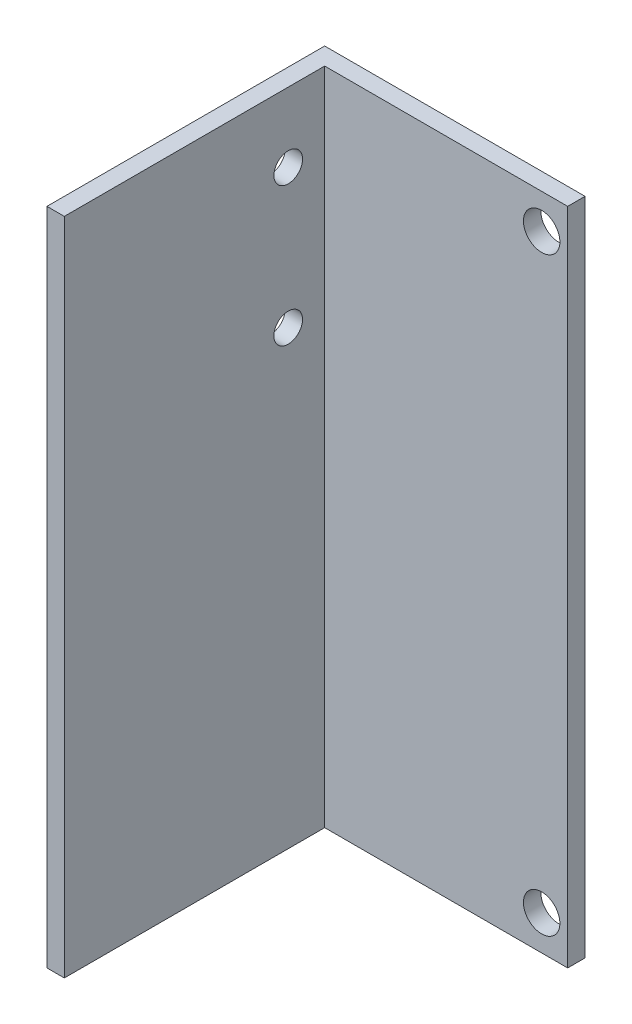
ISO-10303-21;
HEADER;
FILE_DESCRIPTION(('STEP AP214'),'2;1');
FILE_NAME('part.step','',(''),(''),'','','');
FILE_SCHEMA(('AUTOMOTIVE_DESIGN { 1 0 10303 214 1 1 1 1 }'));
ENDSEC;
DATA;
#1=APPLICATION_CONTEXT('core data for automotive mechanical design processes');
#2=APPLICATION_PROTOCOL_DEFINITION('international standard','automotive_design',2000,#1);
#3=PRODUCT_CONTEXT('',#1,'mechanical');
#4=PRODUCT('Part','Part','',(#3));
#5=PRODUCT_RELATED_PRODUCT_CATEGORY('part','',(#4));
#6=PRODUCT_DEFINITION_FORMATION('','',#4);
#7=PRODUCT_DEFINITION_CONTEXT('part definition',#1,'design');
#8=PRODUCT_DEFINITION('design','',#6,#7);
#9=PRODUCT_DEFINITION_SHAPE('','',#8);
#10=(LENGTH_UNIT() NAMED_UNIT(*) SI_UNIT(.MILLI.,.METRE.));
#11=(NAMED_UNIT(*) PLANE_ANGLE_UNIT() SI_UNIT($,.RADIAN.));
#12=(NAMED_UNIT(*) SI_UNIT($,.STERADIAN.) SOLID_ANGLE_UNIT());
#13=UNCERTAINTY_MEASURE_WITH_UNIT(LENGTH_MEASURE(1.E-05),#10,'distance_accuracy_value','');
#14=(GEOMETRIC_REPRESENTATION_CONTEXT(3) GLOBAL_UNCERTAINTY_ASSIGNED_CONTEXT((#13)) GLOBAL_UNIT_ASSIGNED_CONTEXT((#10,
#11,#12)) REPRESENTATION_CONTEXT('',''));
#15=CARTESIAN_POINT('',(0.,0.,0.));
#16=DIRECTION('',(0.,0.,1.));
#17=DIRECTION('',(1.,0.,0.));
#18=AXIS2_PLACEMENT_3D('',#15,#16,#17);
#19=CARTESIAN_POINT('',(0.,0.,2.));
#20=DIRECTION('',(1.,0.,0.));
#21=DIRECTION('',(0.,1.,0.));
#22=AXIS2_PLACEMENT_3D('',#19,#20,#21);
#23=PLANE('',#22);
#24=CARTESIAN_POINT('',(0.,-24.,6.2));
#25=DIRECTION('',(-1.,0.,0.));
#26=DIRECTION('',(0.,-1.,0.));
#27=AXIS2_PLACEMENT_3D('',#24,#25,#26);
#28=CIRCLE('',#27,1.65);
#29=CARTESIAN_POINT('',(0.,-25.65,6.2));
#30=VERTEX_POINT('',#29);
#31=EDGE_CURVE('E151',#30,#30,#28,.T.);
#32=ORIENTED_EDGE('',*,*,#31,.F.);
#33=EDGE_LOOP('',(#32));
#34=FACE_BOUND('',#33,.T.);
#35=CARTESIAN_POINT('',(0.,-8.,6.2));
#36=DIRECTION('',(-1.,0.,0.));
#37=DIRECTION('',(0.,-1.,0.));
#38=AXIS2_PLACEMENT_3D('',#35,#36,#37);
#39=CIRCLE('',#38,1.65);
#40=CARTESIAN_POINT('',(0.,-9.65,6.2));
#41=VERTEX_POINT('',#40);
#42=EDGE_CURVE('E140',#41,#41,#39,.T.);
#43=ORIENTED_EDGE('',*,*,#42,.F.);
#44=EDGE_LOOP('',(#43));
#45=FACE_BOUND('',#44,.T.);
#46=DIRECTION('',(0.,-1.,0.));
#47=VECTOR('',#46,1.);
#48=CARTESIAN_POINT('',(0.,0.,0.));
#49=LINE('',#48,#47);
#50=CARTESIAN_POINT('',(0.,0.,0.));
#51=VERTEX_POINT('',#50);
#52=CARTESIAN_POINT('',(0.,-76.,0.));
#53=VERTEX_POINT('',#52);
#54=EDGE_CURVE('E91',#51,#53,#49,.T.);
#55=ORIENTED_EDGE('',*,*,#54,.T.);
#56=DIRECTION('',(0.,0.,-1.));
#57=VECTOR('',#56,1.);
#58=CARTESIAN_POINT('',(0.,-76.,2.));
#59=LINE('',#58,#57);
#60=CARTESIAN_POINT('',(0.,-76.,32.));
#61=VERTEX_POINT('',#60);
#62=EDGE_CURVE('E11',#61,#53,#59,.T.);
#63=ORIENTED_EDGE('',*,*,#62,.F.);
#64=DIRECTION('',(0.,-1.,0.));
#65=VECTOR('',#64,1.);
#66=CARTESIAN_POINT('',(0.,0.,32.));
#67=LINE('',#66,#65);
#68=CARTESIAN_POINT('',(0.,0.,32.));
#69=VERTEX_POINT('',#68);
#70=EDGE_CURVE('E93',#69,#61,#67,.T.);
#71=ORIENTED_EDGE('',*,*,#70,.F.);
#72=DIRECTION('',(0.,0.,-1.));
#73=VECTOR('',#72,1.);
#74=CARTESIAN_POINT('',(0.,0.,2.));
#75=LINE('',#74,#73);
#76=EDGE_CURVE('E77',#69,#51,#75,.T.);
#77=ORIENTED_EDGE('',*,*,#76,.T.);
#78=EDGE_LOOP('',(#55,#63,#71,#77));
#79=FACE_BOUND('',#78,.T.);
#80=ADVANCED_FACE('F31',(#34,#45,#79),#23,.F.);
#81=CARTESIAN_POINT('',(0.,-76.,2.));
#82=DIRECTION('',(0.,1.,0.));
#83=DIRECTION('',(0.,0.,1.));
#84=AXIS2_PLACEMENT_3D('',#81,#82,#83);
#85=PLANE('',#84);
#86=DIRECTION('',(1.,0.,0.));
#87=VECTOR('',#86,1.);
#88=CARTESIAN_POINT('',(0.,-76.,0.));
#89=LINE('',#88,#87);
#90=CARTESIAN_POINT('',(30.,-76.,0.));
#91=VERTEX_POINT('',#90);
#92=EDGE_CURVE('E97',#53,#91,#89,.T.);
#93=ORIENTED_EDGE('',*,*,#92,.T.);
#94=DIRECTION('',(0.,0.,-1.));
#95=VECTOR('',#94,1.);
#96=CARTESIAN_POINT('',(30.,-76.,2.));
#97=LINE('',#96,#95);
#98=CARTESIAN_POINT('',(30.,-76.,2.));
#99=VERTEX_POINT('',#98);
#100=EDGE_CURVE('E39',#99,#91,#97,.T.);
#101=ORIENTED_EDGE('',*,*,#100,.F.);
#102=DIRECTION('',(1.,0.,0.));
#103=VECTOR('',#102,1.);
#104=CARTESIAN_POINT('',(0.,-76.,2.));
#105=LINE('',#104,#103);
#106=CARTESIAN_POINT('',(2.,-76.,2.));
#107=VERTEX_POINT('',#106);
#108=EDGE_CURVE('E84',#107,#99,#105,.T.);
#109=ORIENTED_EDGE('',*,*,#108,.F.);
#110=DIRECTION('',(0.,0.,-1.));
#111=VECTOR('',#110,1.);
#112=CARTESIAN_POINT('',(2.00000000000001,-76.,32.));
#113=LINE('',#112,#111);
#114=CARTESIAN_POINT('',(2.00000000000001,-76.,32.));
#115=VERTEX_POINT('',#114);
#116=EDGE_CURVE('E98',#115,#107,#113,.T.);
#117=ORIENTED_EDGE('',*,*,#116,.F.);
#118=DIRECTION('',(1.,0.,0.));
#119=VECTOR('',#118,1.);
#120=CARTESIAN_POINT('',(0.,-76.,32.));
#121=LINE('',#120,#119);
#122=EDGE_CURVE('E162',#61,#115,#121,.T.);
#123=ORIENTED_EDGE('',*,*,#122,.F.);
#124=ORIENTED_EDGE('',*,*,#62,.T.);
#125=EDGE_LOOP('',(#93,#101,#109,#117,#123,#124));
#126=FACE_BOUND('',#125,.T.);
#127=ADVANCED_FACE('F175',(#126),#85,.F.);
#128=CARTESIAN_POINT('',(30.,0.,2.));
#129=DIRECTION('',(-1.,0.,0.));
#130=DIRECTION('',(0.,-1.,0.));
#131=AXIS2_PLACEMENT_3D('',#128,#129,#130);
#132=PLANE('',#131);
#133=DIRECTION('',(0.,1.,0.));
#134=VECTOR('',#133,1.);
#135=CARTESIAN_POINT('',(30.,0.,0.));
#136=LINE('',#135,#134);
#137=CARTESIAN_POINT('',(30.,0.,0.));
#138=VERTEX_POINT('',#137);
#139=EDGE_CURVE('E85',#91,#138,#136,.T.);
#140=ORIENTED_EDGE('',*,*,#139,.T.);
#141=DIRECTION('',(0.,0.,-1.));
#142=VECTOR('',#141,1.);
#143=CARTESIAN_POINT('',(30.,0.,2.));
#144=LINE('',#143,#142);
#145=CARTESIAN_POINT('',(30.,0.,2.));
#146=VERTEX_POINT('',#145);
#147=EDGE_CURVE('E80',#146,#138,#144,.T.);
#148=ORIENTED_EDGE('',*,*,#147,.F.);
#149=DIRECTION('',(0.,1.,0.));
#150=VECTOR('',#149,1.);
#151=CARTESIAN_POINT('',(30.,0.,2.));
#152=LINE('',#151,#150);
#153=EDGE_CURVE('E53',#99,#146,#152,.T.);
#154=ORIENTED_EDGE('',*,*,#153,.F.);
#155=ORIENTED_EDGE('',*,*,#100,.T.);
#156=EDGE_LOOP('',(#140,#148,#154,#155));
#157=FACE_BOUND('',#156,.T.);
#158=ADVANCED_FACE('F178',(#157),#132,.F.);
#159=CARTESIAN_POINT('',(0.,0.,2.));
#160=DIRECTION('',(0.,-1.,0.));
#161=DIRECTION('',(0.,0.,-1.));
#162=AXIS2_PLACEMENT_3D('',#159,#160,#161);
#163=PLANE('',#162);
#164=DIRECTION('',(-1.,0.,0.));
#165=VECTOR('',#164,1.);
#166=CARTESIAN_POINT('',(0.,0.,0.));
#167=LINE('',#166,#165);
#168=EDGE_CURVE('E73',#138,#51,#167,.T.);
#169=ORIENTED_EDGE('',*,*,#168,.T.);
#170=ORIENTED_EDGE('',*,*,#76,.F.);
#171=DIRECTION('',(-1.,0.,0.));
#172=VECTOR('',#171,1.);
#173=CARTESIAN_POINT('',(0.,0.,32.));
#174=LINE('',#173,#172);
#175=CARTESIAN_POINT('',(2.,0.,32.));
#176=VERTEX_POINT('',#175);
#177=EDGE_CURVE('E130',#176,#69,#174,.T.);
#178=ORIENTED_EDGE('',*,*,#177,.F.);
#179=DIRECTION('',(0.,0.,-1.));
#180=VECTOR('',#179,1.);
#181=CARTESIAN_POINT('',(2.,0.,32.));
#182=LINE('',#181,#180);
#183=CARTESIAN_POINT('',(2.,0.,2.));
#184=VERTEX_POINT('',#183);
#185=EDGE_CURVE('E102',#176,#184,#182,.T.);
#186=ORIENTED_EDGE('',*,*,#185,.T.);
#187=DIRECTION('',(-1.,0.,0.));
#188=VECTOR('',#187,1.);
#189=CARTESIAN_POINT('',(0.,0.,2.));
#190=LINE('',#189,#188);
#191=EDGE_CURVE('E94',#146,#184,#190,.T.);
#192=ORIENTED_EDGE('',*,*,#191,.F.);
#193=ORIENTED_EDGE('',*,*,#147,.T.);
#194=EDGE_LOOP('',(#169,#170,#178,#186,#192,#193));
#195=FACE_BOUND('',#194,.T.);
#196=ADVANCED_FACE('F75',(#195),#163,.F.);
#197=CARTESIAN_POINT('',(0.,-76.,2.));
#198=DIRECTION('',(0.,0.,1.));
#199=DIRECTION('',(1.,0.,0.));
#200=AXIS2_PLACEMENT_3D('',#197,#198,#199);
#201=PLANE('',#200);
#202=CARTESIAN_POINT('',(27.,-72.,2.));
#203=DIRECTION('',(0.,0.,1.));
#204=DIRECTION('',(1.,0.,0.));
#205=AXIS2_PLACEMENT_3D('',#202,#203,#204);
#206=CIRCLE('',#205,2.1);
#207=CARTESIAN_POINT('',(29.1,-72.,2.));
#208=VERTEX_POINT('',#207);
#209=EDGE_CURVE('E144',#208,#208,#206,.T.);
#210=ORIENTED_EDGE('',*,*,#209,.F.);
#211=EDGE_LOOP('',(#210));
#212=FACE_BOUND('',#211,.T.);
#213=CARTESIAN_POINT('',(27.,-3.99999999999999,2.));
#214=DIRECTION('',(0.,0.,1.));
#215=DIRECTION('',(1.,0.,0.));
#216=AXIS2_PLACEMENT_3D('',#213,#214,#215);
#217=CIRCLE('',#216,2.1);
#218=CARTESIAN_POINT('',(29.1,-3.99999999999999,2.));
#219=VERTEX_POINT('',#218);
#220=EDGE_CURVE('E129',#219,#219,#217,.T.);
#221=ORIENTED_EDGE('',*,*,#220,.F.);
#222=EDGE_LOOP('',(#221));
#223=FACE_BOUND('',#222,.T.);
#224=DIRECTION('',(0.,1.,0.));
#225=VECTOR('',#224,1.);
#226=CARTESIAN_POINT('',(2.,0.,2.));
#227=LINE('',#226,#225);
#228=EDGE_CURVE('E47',#107,#184,#227,.T.);
#229=ORIENTED_EDGE('',*,*,#228,.F.);
#230=ORIENTED_EDGE('',*,*,#108,.T.);
#231=ORIENTED_EDGE('',*,*,#153,.T.);
#232=ORIENTED_EDGE('',*,*,#191,.T.);
#233=EDGE_LOOP('',(#229,#230,#231,#232));
#234=FACE_BOUND('',#233,.T.);
#235=ADVANCED_FACE('F120',(#212,#223,#234),#201,.T.);
#236=CARTESIAN_POINT('',(0.,-76.,0.));
#237=DIRECTION('',(0.,0.,1.));
#238=DIRECTION('',(1.,0.,0.));
#239=AXIS2_PLACEMENT_3D('',#236,#237,#238);
#240=PLANE('',#239);
#241=CARTESIAN_POINT('',(27.,-72.,0.));
#242=DIRECTION('',(0.,0.,-1.));
#243=DIRECTION('',(-1.,0.,0.));
#244=AXIS2_PLACEMENT_3D('',#241,#242,#243);
#245=CIRCLE('',#244,2.1);
#246=CARTESIAN_POINT('',(24.9,-72.,0.));
#247=VERTEX_POINT('',#246);
#248=EDGE_CURVE('E139',#247,#247,#245,.T.);
#249=ORIENTED_EDGE('',*,*,#248,.F.);
#250=EDGE_LOOP('',(#249));
#251=FACE_BOUND('',#250,.T.);
#252=CARTESIAN_POINT('',(27.,-3.99999999999999,0.));
#253=DIRECTION('',(0.,0.,-1.));
#254=DIRECTION('',(-1.,0.,0.));
#255=AXIS2_PLACEMENT_3D('',#252,#253,#254);
#256=CIRCLE('',#255,2.1);
#257=CARTESIAN_POINT('',(24.9,-3.99999999999999,0.));
#258=VERTEX_POINT('',#257);
#259=EDGE_CURVE('E156',#258,#258,#256,.T.);
#260=ORIENTED_EDGE('',*,*,#259,.F.);
#261=EDGE_LOOP('',(#260));
#262=FACE_BOUND('',#261,.T.);
#263=ORIENTED_EDGE('',*,*,#54,.F.);
#264=ORIENTED_EDGE('',*,*,#168,.F.);
#265=ORIENTED_EDGE('',*,*,#139,.F.);
#266=ORIENTED_EDGE('',*,*,#92,.F.);
#267=EDGE_LOOP('',(#263,#264,#265,#266));
#268=FACE_BOUND('',#267,.T.);
#269=ADVANCED_FACE('F96',(#251,#262,#268),#240,.F.);
#270=CARTESIAN_POINT('',(2.,0.,32.));
#271=DIRECTION('',(-1.,0.,0.));
#272=DIRECTION('',(0.,-1.,0.));
#273=AXIS2_PLACEMENT_3D('',#270,#271,#272);
#274=PLANE('',#273);
#275=CARTESIAN_POINT('',(2.00000000000001,-24.,6.2));
#276=DIRECTION('',(-1.,0.,0.));
#277=DIRECTION('',(0.,-1.,0.));
#278=AXIS2_PLACEMENT_3D('',#275,#276,#277);
#279=CIRCLE('',#278,1.65);
#280=CARTESIAN_POINT('',(2.00000000000001,-25.65,6.2));
#281=VERTEX_POINT('',#280);
#282=EDGE_CURVE('E34',#281,#281,#279,.T.);
#283=ORIENTED_EDGE('',*,*,#282,.T.);
#284=EDGE_LOOP('',(#283));
#285=FACE_BOUND('',#284,.T.);
#286=CARTESIAN_POINT('',(2.,-8.,6.2));
#287=DIRECTION('',(-1.,0.,0.));
#288=DIRECTION('',(0.,-1.,0.));
#289=AXIS2_PLACEMENT_3D('',#286,#287,#288);
#290=CIRCLE('',#289,1.65);
#291=CARTESIAN_POINT('',(2.,-9.65,6.2));
#292=VERTEX_POINT('',#291);
#293=EDGE_CURVE('E137',#292,#292,#290,.T.);
#294=ORIENTED_EDGE('',*,*,#293,.T.);
#295=EDGE_LOOP('',(#294));
#296=FACE_BOUND('',#295,.T.);
#297=ORIENTED_EDGE('',*,*,#228,.T.);
#298=ORIENTED_EDGE('',*,*,#185,.F.);
#299=DIRECTION('',(0.,1.,0.));
#300=VECTOR('',#299,1.);
#301=CARTESIAN_POINT('',(2.,0.,32.));
#302=LINE('',#301,#300);
#303=EDGE_CURVE('E132',#115,#176,#302,.T.);
#304=ORIENTED_EDGE('',*,*,#303,.F.);
#305=ORIENTED_EDGE('',*,*,#116,.T.);
#306=EDGE_LOOP('',(#297,#298,#304,#305));
#307=FACE_BOUND('',#306,.T.);
#308=ADVANCED_FACE('F125',(#285,#296,#307),#274,.F.);
#309=CARTESIAN_POINT('',(0.,-76.,32.));
#310=DIRECTION('',(0.,0.,1.));
#311=DIRECTION('',(1.,0.,0.));
#312=AXIS2_PLACEMENT_3D('',#309,#310,#311);
#313=PLANE('',#312);
#314=ORIENTED_EDGE('',*,*,#70,.T.);
#315=ORIENTED_EDGE('',*,*,#122,.T.);
#316=ORIENTED_EDGE('',*,*,#303,.T.);
#317=ORIENTED_EDGE('',*,*,#177,.T.);
#318=EDGE_LOOP('',(#314,#315,#316,#317));
#319=FACE_BOUND('',#318,.T.);
#320=ADVANCED_FACE('F167',(#319),#313,.T.);
#321=CARTESIAN_POINT('',(27.,-3.99999999999999,32.000025));
#322=DIRECTION('',(0.,0.,-1.));
#323=DIRECTION('',(-1.,0.,0.));
#324=AXIS2_PLACEMENT_3D('',#321,#322,#323);
#325=CYLINDRICAL_SURFACE('',#324,2.1);
#326=ORIENTED_EDGE('',*,*,#220,.T.);
#327=EDGE_LOOP('',(#326));
#328=FACE_BOUND('',#327,.T.);
#329=ORIENTED_EDGE('',*,*,#259,.T.);
#330=EDGE_LOOP('',(#329));
#331=FACE_BOUND('',#330,.T.);
#332=ADVANCED_FACE('F207',(#328,#331),#325,.F.);
#333=CARTESIAN_POINT('',(27.,-72.,32.000025));
#334=DIRECTION('',(0.,0.,-1.));
#335=DIRECTION('',(-1.,0.,0.));
#336=AXIS2_PLACEMENT_3D('',#333,#334,#335);
#337=CYLINDRICAL_SURFACE('',#336,2.1);
#338=ORIENTED_EDGE('',*,*,#209,.T.);
#339=EDGE_LOOP('',(#338));
#340=FACE_BOUND('',#339,.T.);
#341=ORIENTED_EDGE('',*,*,#248,.T.);
#342=EDGE_LOOP('',(#341));
#343=FACE_BOUND('',#342,.T.);
#344=ADVANCED_FACE('F223',(#340,#343),#337,.F.);
#345=CARTESIAN_POINT('',(30.000025,-8.,6.2));
#346=DIRECTION('',(-1.,0.,0.));
#347=DIRECTION('',(0.,-1.,0.));
#348=AXIS2_PLACEMENT_3D('',#345,#346,#347);
#349=CYLINDRICAL_SURFACE('',#348,1.65);
#350=CARTESIAN_POINT('',(0.,-9.65,6.2));
#351=CARTESIAN_POINT('',(0.0208333333333333,-9.65,6.2));
#352=CARTESIAN_POINT('',(0.0416666666666667,-9.65,6.2));
#353=CARTESIAN_POINT('',(0.0833333333333334,-9.65,6.2));
#354=CARTESIAN_POINT('',(0.104166666666667,-9.65,6.2));
#355=CARTESIAN_POINT('',(0.145833333333333,-9.65,6.2));
#356=CARTESIAN_POINT('',(0.166666666666667,-9.65,6.2));
#357=CARTESIAN_POINT('',(0.208333333333334,-9.65,6.2));
#358=CARTESIAN_POINT('',(0.229166666666667,-9.65,6.2));
#359=CARTESIAN_POINT('',(0.270833333333334,-9.65,6.2));
#360=CARTESIAN_POINT('',(0.291666666666667,-9.65,6.2));
#361=CARTESIAN_POINT('',(0.333333333333334,-9.65,6.2));
#362=CARTESIAN_POINT('',(0.354166666666667,-9.65,6.2));
#363=CARTESIAN_POINT('',(0.395833333333334,-9.65,6.2));
#364=CARTESIAN_POINT('',(0.416666666666667,-9.65,6.2));
#365=CARTESIAN_POINT('',(0.458333333333334,-9.65,6.2));
#366=CARTESIAN_POINT('',(0.479166666666667,-9.65,6.2));
#367=CARTESIAN_POINT('',(0.520833333333334,-9.65,6.2));
#368=CARTESIAN_POINT('',(0.541666666666667,-9.65,6.2));
#369=CARTESIAN_POINT('',(0.583333333333334,-9.65,6.2));
#370=CARTESIAN_POINT('',(0.604166666666667,-9.65,6.2));
#371=CARTESIAN_POINT('',(0.645833333333334,-9.65,6.2));
#372=CARTESIAN_POINT('',(0.666666666666667,-9.65,6.2));
#373=CARTESIAN_POINT('',(0.708333333333334,-9.65,6.2));
#374=CARTESIAN_POINT('',(0.729166666666667,-9.65,6.2));
#375=CARTESIAN_POINT('',(0.770833333333334,-9.65,6.2));
#376=CARTESIAN_POINT('',(0.791666666666667,-9.65,6.2));
#377=CARTESIAN_POINT('',(0.833333333333334,-9.65,6.2));
#378=CARTESIAN_POINT('',(0.854166666666667,-9.65,6.2));
#379=CARTESIAN_POINT('',(0.895833333333334,-9.65,6.2));
#380=CARTESIAN_POINT('',(0.916666666666668,-9.65,6.2));
#381=CARTESIAN_POINT('',(0.958333333333334,-9.65,6.2));
#382=CARTESIAN_POINT('',(0.979166666666668,-9.65,6.2));
#383=CARTESIAN_POINT('',(1.02083333333333,-9.65,6.2));
#384=CARTESIAN_POINT('',(1.04166666666667,-9.65,6.2));
#385=CARTESIAN_POINT('',(1.08333333333333,-9.65,6.2));
#386=CARTESIAN_POINT('',(1.10416666666667,-9.65,6.2));
#387=CARTESIAN_POINT('',(1.14583333333333,-9.65,6.2));
#388=CARTESIAN_POINT('',(1.16666666666667,-9.65,6.2));
#389=CARTESIAN_POINT('',(1.20833333333333,-9.65,6.2));
#390=CARTESIAN_POINT('',(1.22916666666667,-9.65,6.2));
#391=CARTESIAN_POINT('',(1.27083333333333,-9.65,6.2));
#392=CARTESIAN_POINT('',(1.29166666666667,-9.65,6.2));
#393=CARTESIAN_POINT('',(1.33333333333333,-9.65,6.2));
#394=CARTESIAN_POINT('',(1.35416666666667,-9.65,6.2));
#395=CARTESIAN_POINT('',(1.39583333333333,-9.65,6.2));
#396=CARTESIAN_POINT('',(1.41666666666667,-9.65,6.2));
#397=CARTESIAN_POINT('',(1.45833333333333,-9.65,6.2));
#398=CARTESIAN_POINT('',(1.47916666666667,-9.65,6.2));
#399=CARTESIAN_POINT('',(1.52083333333333,-9.65,6.2));
#400=CARTESIAN_POINT('',(1.54166666666667,-9.65,6.2));
#401=CARTESIAN_POINT('',(1.58333333333333,-9.65,6.2));
#402=CARTESIAN_POINT('',(1.60416666666667,-9.65,6.2));
#403=CARTESIAN_POINT('',(1.64583333333333,-9.65,6.2));
#404=CARTESIAN_POINT('',(1.66666666666667,-9.65,6.2));
#405=CARTESIAN_POINT('',(1.70833333333333,-9.65,6.2));
#406=CARTESIAN_POINT('',(1.72916666666667,-9.65,6.2));
#407=CARTESIAN_POINT('',(1.77083333333334,-9.65,6.2));
#408=CARTESIAN_POINT('',(1.79166666666667,-9.65,6.2));
#409=CARTESIAN_POINT('',(1.83333333333334,-9.65,6.2));
#410=CARTESIAN_POINT('',(1.85416666666667,-9.65,6.2));
#411=CARTESIAN_POINT('',(1.89583333333334,-9.65,6.2));
#412=CARTESIAN_POINT('',(1.91666666666667,-9.65,6.2));
#413=CARTESIAN_POINT('',(1.95833333333334,-9.65,6.2));
#414=CARTESIAN_POINT('',(1.97916666666667,-9.65,6.2));
#415=CARTESIAN_POINT('',(2.,-9.65,6.2));
#416=B_SPLINE_CURVE_WITH_KNOTS('',3,(#350,#351,#352,#353,#354,#355,#356,#357,#358,#359,#360,
#361,#362,#363,#364,#365,#366,#367,#368,#369,#370,#371,#372,#373,#374,#375,#376,#377,#378,#379,
#380,#381,#382,#383,#384,#385,#386,#387,#388,#389,#390,#391,#392,#393,#394,#395,#396,#397,#398,
#399,#400,#401,#402,#403,#404,#405,#406,#407,#408,#409,#410,#411,#412,#413,#414,#415),
.UNSPECIFIED.,.F.,.F.,(4,2,2,2,2,2,2,2,2,2,2,2,2,2,2,2,2,2,2,2,2,2,2,2,2,2,2,2,2,2,2,2,4),(0.,
0.0625000000000001,0.125,0.1875,0.25,0.3125,0.375,0.4375,0.5,0.5625,0.625000000000001,
0.687500000000001,0.750000000000001,0.812500000000001,0.875000000000001,0.937500000000001,1.,
1.0625,1.125,1.1875,1.25,1.3125,1.375,1.4375,1.5,1.5625,1.625,1.6875,1.75,1.8125,1.875,1.9375,
2.),.UNSPECIFIED.);
#417=EDGE_CURVE('BSEAM197',#41,#292,#416,.T.);
#418=ORIENTED_EDGE('',*,*,#42,.T.);
#419=ORIENTED_EDGE('',*,*,#293,.F.);
#420=ORIENTED_EDGE('',*,*,#417,.T.);
#421=ORIENTED_EDGE('',*,*,#417,.F.);
#422=EDGE_LOOP('',(#418,#420,#419,#421));
#423=FACE_BOUND('',#422,.T.);
#424=ADVANCED_FACE('F197',(#423),#349,.F.);
#425=CARTESIAN_POINT('',(30.000025,-24.,6.2));
#426=DIRECTION('',(-1.,0.,0.));
#427=DIRECTION('',(0.,-1.,0.));
#428=AXIS2_PLACEMENT_3D('',#425,#426,#427);
#429=CYLINDRICAL_SURFACE('',#428,1.65);
#430=CARTESIAN_POINT('',(0.,-25.65,6.2));
#431=CARTESIAN_POINT('',(0.0208333333333368,-25.65,6.2));
#432=CARTESIAN_POINT('',(0.0416666666666702,-25.65,6.2));
#433=CARTESIAN_POINT('',(0.0833333333333369,-25.65,6.2));
#434=CARTESIAN_POINT('',(0.10416666666667,-25.65,6.2));
#435=CARTESIAN_POINT('',(0.145833333333337,-25.65,6.2));
#436=CARTESIAN_POINT('',(0.16666666666667,-25.65,6.2));
#437=CARTESIAN_POINT('',(0.208333333333337,-25.65,6.2));
#438=CARTESIAN_POINT('',(0.22916666666667,-25.65,6.2));
#439=CARTESIAN_POINT('',(0.270833333333337,-25.65,6.2));
#440=CARTESIAN_POINT('',(0.29166666666667,-25.65,6.2));
#441=CARTESIAN_POINT('',(0.333333333333337,-25.65,6.2));
#442=CARTESIAN_POINT('',(0.35416666666667,-25.65,6.2));
#443=CARTESIAN_POINT('',(0.395833333333337,-25.65,6.2));
#444=CARTESIAN_POINT('',(0.416666666666671,-25.65,6.2));
#445=CARTESIAN_POINT('',(0.458333333333337,-25.65,6.2));
#446=CARTESIAN_POINT('',(0.479166666666671,-25.65,6.2));
#447=CARTESIAN_POINT('',(0.520833333333337,-25.65,6.2));
#448=CARTESIAN_POINT('',(0.541666666666671,-25.65,6.2));
#449=CARTESIAN_POINT('',(0.583333333333337,-25.65,6.2));
#450=CARTESIAN_POINT('',(0.604166666666671,-25.65,6.2));
#451=CARTESIAN_POINT('',(0.645833333333337,-25.65,6.2));
#452=CARTESIAN_POINT('',(0.666666666666671,-25.65,6.2));
#453=CARTESIAN_POINT('',(0.708333333333337,-25.65,6.2));
#454=CARTESIAN_POINT('',(0.729166666666671,-25.65,6.2));
#455=CARTESIAN_POINT('',(0.770833333333337,-25.65,6.2));
#456=CARTESIAN_POINT('',(0.791666666666671,-25.65,6.2));
#457=CARTESIAN_POINT('',(0.833333333333337,-25.65,6.2));
#458=CARTESIAN_POINT('',(0.854166666666671,-25.65,6.2));
#459=CARTESIAN_POINT('',(0.895833333333338,-25.65,6.2));
#460=CARTESIAN_POINT('',(0.916666666666671,-25.65,6.2));
#461=CARTESIAN_POINT('',(0.958333333333338,-25.65,6.2));
#462=CARTESIAN_POINT('',(0.979166666666671,-25.65,6.2));
#463=CARTESIAN_POINT('',(1.02083333333334,-25.65,6.2));
#464=CARTESIAN_POINT('',(1.04166666666667,-25.65,6.2));
#465=CARTESIAN_POINT('',(1.08333333333334,-25.65,6.2));
#466=CARTESIAN_POINT('',(1.10416666666667,-25.65,6.2));
#467=CARTESIAN_POINT('',(1.14583333333334,-25.65,6.2));
#468=CARTESIAN_POINT('',(1.16666666666667,-25.65,6.2));
#469=CARTESIAN_POINT('',(1.20833333333334,-25.65,6.2));
#470=CARTESIAN_POINT('',(1.22916666666667,-25.65,6.2));
#471=CARTESIAN_POINT('',(1.27083333333334,-25.65,6.2));
#472=CARTESIAN_POINT('',(1.29166666666667,-25.65,6.2));
#473=CARTESIAN_POINT('',(1.33333333333334,-25.65,6.2));
#474=CARTESIAN_POINT('',(1.35416666666667,-25.65,6.2));
#475=CARTESIAN_POINT('',(1.39583333333334,-25.65,6.2));
#476=CARTESIAN_POINT('',(1.41666666666667,-25.65,6.2));
#477=CARTESIAN_POINT('',(1.45833333333334,-25.65,6.2));
#478=CARTESIAN_POINT('',(1.47916666666667,-25.65,6.2));
#479=CARTESIAN_POINT('',(1.52083333333334,-25.65,6.2));
#480=CARTESIAN_POINT('',(1.54166666666667,-25.65,6.2));
#481=CARTESIAN_POINT('',(1.58333333333334,-25.65,6.2));
#482=CARTESIAN_POINT('',(1.60416666666667,-25.65,6.2));
#483=CARTESIAN_POINT('',(1.64583333333334,-25.65,6.2));
#484=CARTESIAN_POINT('',(1.66666666666667,-25.65,6.2));
#485=CARTESIAN_POINT('',(1.70833333333334,-25.65,6.2));
#486=CARTESIAN_POINT('',(1.72916666666667,-25.65,6.2));
#487=CARTESIAN_POINT('',(1.77083333333334,-25.65,6.2));
#488=CARTESIAN_POINT('',(1.79166666666667,-25.65,6.2));
#489=CARTESIAN_POINT('',(1.83333333333334,-25.65,6.2));
#490=CARTESIAN_POINT('',(1.85416666666667,-25.65,6.2));
#491=CARTESIAN_POINT('',(1.89583333333334,-25.65,6.2));
#492=CARTESIAN_POINT('',(1.91666666666667,-25.65,6.2));
#493=CARTESIAN_POINT('',(1.95833333333334,-25.65,6.2));
#494=CARTESIAN_POINT('',(1.97916666666667,-25.65,6.2));
#495=CARTESIAN_POINT('',(2.00000000000001,-25.65,6.2));
#496=B_SPLINE_CURVE_WITH_KNOTS('',3,(#430,#431,#432,#433,#434,#435,#436,#437,#438,#439,#440,
#441,#442,#443,#444,#445,#446,#447,#448,#449,#450,#451,#452,#453,#454,#455,#456,#457,#458,#459,
#460,#461,#462,#463,#464,#465,#466,#467,#468,#469,#470,#471,#472,#473,#474,#475,#476,#477,#478,
#479,#480,#481,#482,#483,#484,#485,#486,#487,#488,#489,#490,#491,#492,#493,#494,#495),
.UNSPECIFIED.,.F.,.F.,(4,2,2,2,2,2,2,2,2,2,2,2,2,2,2,2,2,2,2,2,2,2,2,2,2,2,2,2,2,2,2,2,4),(0.,
0.0625000000000001,0.125,0.1875,0.25,0.3125,0.375,0.4375,0.5,0.5625,0.625000000000001,
0.687500000000001,0.750000000000001,0.812500000000001,0.875000000000001,0.937500000000001,1.,
1.0625,1.125,1.1875,1.25,1.3125,1.375,1.4375,1.5,1.5625,1.625,1.6875,1.75,1.8125,1.875,1.9375,
2.),.UNSPECIFIED.);
#497=EDGE_CURVE('BSEAM194',#30,#281,#496,.T.);
#498=ORIENTED_EDGE('',*,*,#31,.T.);
#499=ORIENTED_EDGE('',*,*,#282,.F.);
#500=ORIENTED_EDGE('',*,*,#497,.T.);
#501=ORIENTED_EDGE('',*,*,#497,.F.);
#502=EDGE_LOOP('',(#498,#500,#499,#501));
#503=FACE_BOUND('',#502,.T.);
#504=ADVANCED_FACE('F194',(#503),#429,.F.);
#505=CLOSED_SHELL('',(#80,#127,#158,#196,#235,#269,#308,#320,#332,#344,#424,#504));
#506=MANIFOLD_SOLID_BREP('B2',#505);
#507=ADVANCED_BREP_SHAPE_REPRESENTATION('',(#18,#506),#14);
#508=SHAPE_DEFINITION_REPRESENTATION(#9,#507);
ENDSEC;
END-ISO-10303-21;
